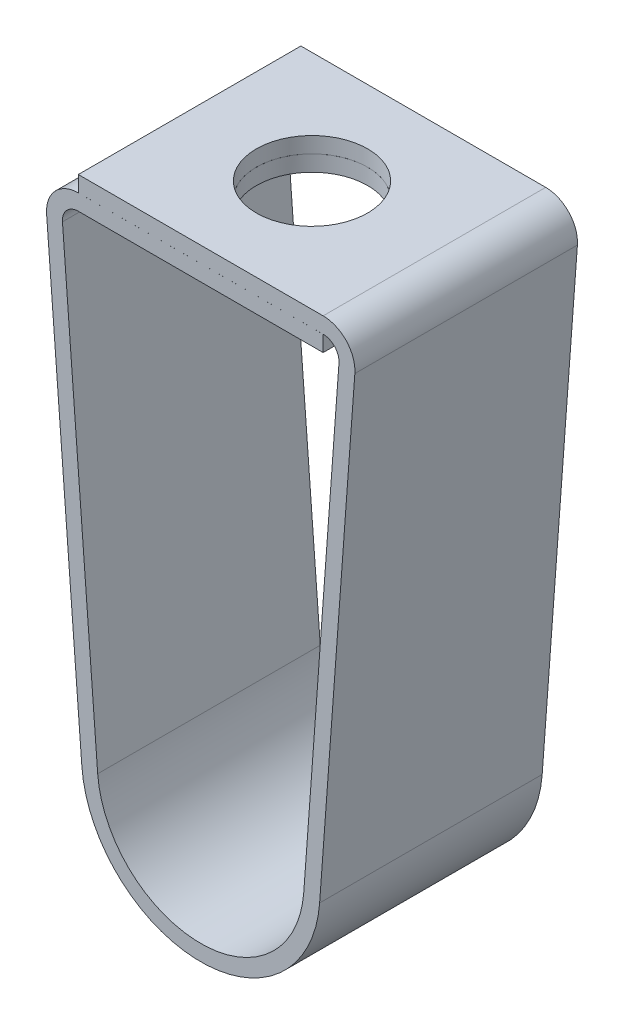
ISO-10303-21;
HEADER;
FILE_DESCRIPTION(('STEP AP214'),'2;1');
FILE_NAME('part.step','',(''),(''),'','','');
FILE_SCHEMA(('AUTOMOTIVE_DESIGN { 1 0 10303 214 1 1 1 1 }'));
ENDSEC;
DATA;
#1=APPLICATION_CONTEXT('core data for automotive mechanical design processes');
#2=APPLICATION_PROTOCOL_DEFINITION('international standard','automotive_design',2000,#1);
#3=PRODUCT_CONTEXT('',#1,'mechanical');
#4=PRODUCT('Part','Part','',(#3));
#5=PRODUCT_RELATED_PRODUCT_CATEGORY('part','',(#4));
#6=PRODUCT_DEFINITION_FORMATION('','',#4);
#7=PRODUCT_DEFINITION_CONTEXT('part definition',#1,'design');
#8=PRODUCT_DEFINITION('design','',#6,#7);
#9=PRODUCT_DEFINITION_SHAPE('','',#8);
#10=(LENGTH_UNIT() NAMED_UNIT(*) SI_UNIT(.MILLI.,.METRE.));
#11=(NAMED_UNIT(*) PLANE_ANGLE_UNIT() SI_UNIT($,.RADIAN.));
#12=(NAMED_UNIT(*) SI_UNIT($,.STERADIAN.) SOLID_ANGLE_UNIT());
#13=UNCERTAINTY_MEASURE_WITH_UNIT(LENGTH_MEASURE(1.E-05),#10,'distance_accuracy_value','');
#14=(GEOMETRIC_REPRESENTATION_CONTEXT(3) GLOBAL_UNCERTAINTY_ASSIGNED_CONTEXT((#13)) GLOBAL_UNIT_ASSIGNED_CONTEXT((#10,
#11,#12)) REPRESENTATION_CONTEXT('',''));
#15=CARTESIAN_POINT('',(0.,0.,0.));
#16=DIRECTION('',(0.,0.,1.));
#17=DIRECTION('',(1.,0.,0.));
#18=AXIS2_PLACEMENT_3D('',#15,#16,#17);
#19=CARTESIAN_POINT('',(-12.22375,48.48225,11.1125));
#20=DIRECTION('',(0.,1.,0.));
#21=DIRECTION('',(-1.,0.,0.));
#22=AXIS2_PLACEMENT_3D('',#19,#20,#21);
#23=PLANE('',#22);
#24=DIRECTION('',(1.,0.,0.));
#25=VECTOR('',#24,1.);
#26=CARTESIAN_POINT('',(-12.22375,48.48225,-11.1125));
#27=LINE('',#26,#25);
#28=CARTESIAN_POINT('',(-12.22375,48.48225,-11.1125));
#29=VERTEX_POINT('',#28);
#30=CARTESIAN_POINT('',(12.22375,48.48225,-11.1125));
#31=VERTEX_POINT('',#30);
#32=EDGE_CURVE('E185',#29,#31,#27,.T.);
#33=ORIENTED_EDGE('',*,*,#32,.T.);
#34=DIRECTION('',(0.,0.,-1.));
#35=VECTOR('',#34,1.);
#36=CARTESIAN_POINT('',(12.22375,48.48225,11.1125));
#37=LINE('',#36,#35);
#38=CARTESIAN_POINT('',(12.22375,48.48225,11.1125));
#39=VERTEX_POINT('',#38);
#40=EDGE_CURVE('E46',#39,#31,#37,.T.);
#41=ORIENTED_EDGE('',*,*,#40,.F.);
#42=DIRECTION('',(1.,0.,0.));
#43=VECTOR('',#42,1.);
#44=CARTESIAN_POINT('',(-12.22375,48.48225,11.1125));
#45=LINE('',#44,#43);
#46=CARTESIAN_POINT('',(-12.22375,48.48225,11.1125));
#47=VERTEX_POINT('',#46);
#48=EDGE_CURVE('E121',#47,#39,#45,.T.);
#49=ORIENTED_EDGE('',*,*,#48,.F.);
#50=DIRECTION('',(0.,0.,-1.));
#51=VECTOR('',#50,1.);
#52=CARTESIAN_POINT('',(-12.22375,48.48225,11.1125));
#53=LINE('',#52,#51);
#54=EDGE_CURVE('E11',#47,#29,#53,.T.);
#55=ORIENTED_EDGE('',*,*,#54,.T.);
#56=EDGE_LOOP('',(#33,#41,#49,#55));
#57=FACE_BOUND('',#56,.T.);
#58=CARTESIAN_POINT('',(0.,48.48225,0.));
#59=DIRECTION('',(0.,1.,0.));
#60=DIRECTION('',(-1.,0.,0.));
#61=AXIS2_PLACEMENT_3D('',#58,#59,#60);
#62=CIRCLE('',#61,5.55625);
#63=CARTESIAN_POINT('',(-5.55625,48.48225,0.));
#64=VERTEX_POINT('',#63);
#65=EDGE_CURVE('E186',#64,#64,#62,.F.);
#66=ORIENTED_EDGE('',*,*,#65,.F.);
#67=EDGE_LOOP('',(#66));
#68=FACE_BOUND('',#67,.T.);
#69=ADVANCED_FACE('F37',(#57,#68),#23,.F.);
#70=CARTESIAN_POINT('',(12.22375,46.8922099999997,11.1125));
#71=DIRECTION('',(0.,1.,0.));
#72=DIRECTION('',(-1.,0.,0.));
#73=AXIS2_PLACEMENT_3D('',#70,#71,#72);
#74=PLANE('',#73);
#75=DIRECTION('',(1.,0.,0.));
#76=VECTOR('',#75,1.);
#77=CARTESIAN_POINT('',(12.22375,46.8922099999997,-11.1125));
#78=LINE('',#77,#76);
#79=CARTESIAN_POINT('',(-12.22375,46.8922099999997,-11.1125));
#80=VERTEX_POINT('',#79);
#81=CARTESIAN_POINT('',(12.22375,46.8922099999997,-11.1125));
#82=VERTEX_POINT('',#81);
#83=EDGE_CURVE('E198',#80,#82,#78,.T.);
#84=ORIENTED_EDGE('',*,*,#83,.T.);
#85=DIRECTION('',(0.,0.,-1.));
#86=VECTOR('',#85,1.);
#87=CARTESIAN_POINT('',(12.22375,46.8922099999997,11.1125));
#88=LINE('',#87,#86);
#89=CARTESIAN_POINT('',(12.22375,46.8922099999997,11.1125));
#90=VERTEX_POINT('',#89);
#91=EDGE_CURVE('E229',#90,#82,#88,.T.);
#92=ORIENTED_EDGE('',*,*,#91,.F.);
#93=DIRECTION('',(1.,0.,0.));
#94=VECTOR('',#93,1.);
#95=CARTESIAN_POINT('',(12.22375,46.8922099999997,11.1125));
#96=LINE('',#95,#94);
#97=CARTESIAN_POINT('',(-12.22375,46.8922099999997,11.1125));
#98=VERTEX_POINT('',#97);
#99=EDGE_CURVE('E278',#98,#90,#96,.T.);
#100=ORIENTED_EDGE('',*,*,#99,.F.);
#101=DIRECTION('',(0.,0.,-1.));
#102=VECTOR('',#101,1.);
#103=CARTESIAN_POINT('',(-12.22375,46.8922099999997,11.1125));
#104=LINE('',#103,#102);
#105=EDGE_CURVE('E232',#98,#80,#104,.T.);
#106=ORIENTED_EDGE('',*,*,#105,.T.);
#107=EDGE_LOOP('',(#84,#92,#100,#106));
#108=FACE_BOUND('',#107,.T.);
#109=CARTESIAN_POINT('',(0.,46.8922099999997,0.));
#110=DIRECTION('',(0.,1.,0.));
#111=DIRECTION('',(-1.,0.,0.));
#112=AXIS2_PLACEMENT_3D('',#109,#110,#111);
#113=CIRCLE('',#112,5.55625);
#114=CARTESIAN_POINT('',(-5.55625,46.8922099999997,0.));
#115=VERTEX_POINT('',#114);
#116=EDGE_CURVE('E312',#115,#115,#113,.F.);
#117=ORIENTED_EDGE('',*,*,#116,.F.);
#118=EDGE_LOOP('',(#117));
#119=FACE_BOUND('',#118,.T.);
#120=ADVANCED_FACE('F325',(#108,#119),#74,.F.);
#121=CARTESIAN_POINT('',(-12.22375,48.4797099999997,11.1125));
#122=DIRECTION('',(0.,-1.,0.));
#123=DIRECTION('',(1.,0.,0.));
#124=AXIS2_PLACEMENT_3D('',#121,#122,#123);
#125=PLANE('',#124);
#126=DIRECTION('',(-1.,0.,0.));
#127=VECTOR('',#126,1.);
#128=CARTESIAN_POINT('',(-12.22375,48.4797099999997,-11.1125));
#129=LINE('',#128,#127);
#130=CARTESIAN_POINT('',(12.22375,48.4797099999997,-11.1125));
#131=VERTEX_POINT('',#130);
#132=CARTESIAN_POINT('',(-12.22375,48.4797099999997,-11.1125));
#133=VERTEX_POINT('',#132);
#134=EDGE_CURVE('E202',#131,#133,#129,.T.);
#135=ORIENTED_EDGE('',*,*,#134,.T.);
#136=DIRECTION('',(0.,0.,-1.));
#137=VECTOR('',#136,1.);
#138=CARTESIAN_POINT('',(-12.22375,48.4797099999997,11.1125));
#139=LINE('',#138,#137);
#140=CARTESIAN_POINT('',(-12.22375,48.4797099999997,11.1125));
#141=VERTEX_POINT('',#140);
#142=EDGE_CURVE('E223',#141,#133,#139,.T.);
#143=ORIENTED_EDGE('',*,*,#142,.F.);
#144=DIRECTION('',(-1.,0.,0.));
#145=VECTOR('',#144,1.);
#146=CARTESIAN_POINT('',(-12.22375,48.4797099999997,11.1125));
#147=LINE('',#146,#145);
#148=CARTESIAN_POINT('',(12.22375,48.4797099999997,11.1125));
#149=VERTEX_POINT('',#148);
#150=EDGE_CURVE('E282',#149,#141,#147,.T.);
#151=ORIENTED_EDGE('',*,*,#150,.F.);
#152=DIRECTION('',(0.,0.,-1.));
#153=VECTOR('',#152,1.);
#154=CARTESIAN_POINT('',(12.22375,48.4797099999997,11.1125));
#155=LINE('',#154,#153);
#156=EDGE_CURVE('E226',#149,#131,#155,.T.);
#157=ORIENTED_EDGE('',*,*,#156,.T.);
#158=EDGE_LOOP('',(#135,#143,#151,#157));
#159=FACE_BOUND('',#158,.T.);
#160=CARTESIAN_POINT('',(0.,48.4797099999997,0.));
#161=DIRECTION('',(0.,-1.,0.));
#162=DIRECTION('',(1.,0.,0.));
#163=AXIS2_PLACEMENT_3D('',#160,#161,#162);
#164=CIRCLE('',#163,5.55625);
#165=CARTESIAN_POINT('',(5.55625,48.4797099999997,0.));
#166=VERTEX_POINT('',#165);
#167=EDGE_CURVE('E309',#166,#166,#164,.F.);
#168=ORIENTED_EDGE('',*,*,#167,.F.);
#169=EDGE_LOOP('',(#168));
#170=FACE_BOUND('',#169,.T.);
#171=ADVANCED_FACE('F303',(#159,#170),#125,.F.);
#172=CARTESIAN_POINT('',(-12.22375,50.06975,11.1125));
#173=DIRECTION('',(0.,-1.,0.));
#174=DIRECTION('',(0.,0.,-1.));
#175=AXIS2_PLACEMENT_3D('',#172,#173,#174);
#176=PLANE('',#175);
#177=DIRECTION('',(-1.,0.,0.));
#178=VECTOR('',#177,1.);
#179=CARTESIAN_POINT('',(-12.22375,50.06975,-11.1125));
#180=LINE('',#179,#178);
#181=CARTESIAN_POINT('',(12.22375,50.06975,-11.1125));
#182=VERTEX_POINT('',#181);
#183=CARTESIAN_POINT('',(-12.22375,50.06975,-11.1125));
#184=VERTEX_POINT('',#183);
#185=EDGE_CURVE('E113',#182,#184,#180,.T.);
#186=ORIENTED_EDGE('',*,*,#185,.T.);
#187=DIRECTION('',(0.,0.,-1.));
#188=VECTOR('',#187,1.);
#189=CARTESIAN_POINT('',(-12.22375,50.06975,11.1125));
#190=LINE('',#189,#188);
#191=CARTESIAN_POINT('',(-12.22375,50.06975,11.1125));
#192=VERTEX_POINT('',#191);
#193=EDGE_CURVE('E178',#192,#184,#190,.T.);
#194=ORIENTED_EDGE('',*,*,#193,.F.);
#195=DIRECTION('',(-1.,0.,0.));
#196=VECTOR('',#195,1.);
#197=CARTESIAN_POINT('',(-12.22375,50.06975,11.1125));
#198=LINE('',#197,#196);
#199=CARTESIAN_POINT('',(12.22375,50.06975,11.1125));
#200=VERTEX_POINT('',#199);
#201=EDGE_CURVE('E54',#200,#192,#198,.T.);
#202=ORIENTED_EDGE('',*,*,#201,.F.);
#203=DIRECTION('',(0.,0.,-1.));
#204=VECTOR('',#203,1.);
#205=CARTESIAN_POINT('',(12.22375,50.06975,11.1125));
#206=LINE('',#205,#204);
#207=EDGE_CURVE('E174',#200,#182,#206,.T.);
#208=ORIENTED_EDGE('',*,*,#207,.T.);
#209=EDGE_LOOP('',(#186,#194,#202,#208));
#210=FACE_BOUND('',#209,.T.);
#211=CARTESIAN_POINT('',(0.,50.06975,0.));
#212=DIRECTION('',(0.,1.,0.));
#213=DIRECTION('',(0.,0.,1.));
#214=AXIS2_PLACEMENT_3D('',#211,#212,#213);
#215=CIRCLE('',#214,5.55625);
#216=CARTESIAN_POINT('',(0.,50.06975,5.55625));
#217=VERTEX_POINT('',#216);
#218=EDGE_CURVE('E307',#217,#217,#215,.T.);
#219=ORIENTED_EDGE('',*,*,#218,.F.);
#220=EDGE_LOOP('',(#219));
#221=FACE_BOUND('',#220,.T.);
#222=ADVANCED_FACE('F300',(#210,#221),#176,.F.);
#223=CARTESIAN_POINT('',(-12.22375,50.06975,11.1125));
#224=DIRECTION('',(1.,0.,0.));
#225=DIRECTION('',(0.,1.,0.));
#226=AXIS2_PLACEMENT_3D('',#223,#224,#225);
#227=PLANE('',#226);
#228=DIRECTION('',(0.,-1.,0.));
#229=VECTOR('',#228,1.);
#230=CARTESIAN_POINT('',(-12.22375,50.06975,-11.1125));
#231=LINE('',#230,#229);
#232=EDGE_CURVE('E182',#184,#29,#231,.T.);
#233=ORIENTED_EDGE('',*,*,#232,.T.);
#234=ORIENTED_EDGE('',*,*,#54,.F.);
#235=DIRECTION('',(0.,-1.,0.));
#236=VECTOR('',#235,1.);
#237=CARTESIAN_POINT('',(-12.22375,50.06975,11.1125));
#238=LINE('',#237,#236);
#239=EDGE_CURVE('E213',#192,#47,#238,.T.);
#240=ORIENTED_EDGE('',*,*,#239,.F.);
#241=ORIENTED_EDGE('',*,*,#193,.T.);
#242=EDGE_LOOP('',(#233,#234,#240,#241));
#243=FACE_BOUND('',#242,.T.);
#244=ADVANCED_FACE('F39',(#243),#227,.F.);
#245=CARTESIAN_POINT('',(12.22375,46.89475,11.1125));
#246=DIRECTION('',(0.,0.,-1.));
#247=DIRECTION('',(-1.,0.,0.));
#248=AXIS2_PLACEMENT_3D('',#245,#246,#247);
#249=CYLINDRICAL_SURFACE('',#248,1.5875);
#250=CARTESIAN_POINT('',(12.22375,46.89475,-11.1125));
#251=DIRECTION('',(0.,0.,-1.));
#252=DIRECTION('',(1.,0.,0.));
#253=AXIS2_PLACEMENT_3D('',#250,#251,#252);
#254=CIRCLE('',#253,1.5875);
#255=CARTESIAN_POINT('',(13.8069250792984,46.7776478297022,-11.1125));
#256=VERTEX_POINT('',#255);
#257=EDGE_CURVE('E188',#31,#256,#254,.T.);
#258=ORIENTED_EDGE('',*,*,#257,.T.);
#259=DIRECTION('',(0.,0.,-1.));
#260=VECTOR('',#259,1.);
#261=CARTESIAN_POINT('',(13.8069250792984,46.7776478297022,11.1125));
#262=LINE('',#261,#260);
#263=CARTESIAN_POINT('',(13.8069250792984,46.7776478297022,11.1125));
#264=VERTEX_POINT('',#263);
#265=EDGE_CURVE('E244',#264,#256,#262,.T.);
#266=ORIENTED_EDGE('',*,*,#265,.F.);
#267=CARTESIAN_POINT('',(12.22375,46.89475,11.1125));
#268=DIRECTION('',(0.,0.,-1.));
#269=DIRECTION('',(1.,0.,0.));
#270=AXIS2_PLACEMENT_3D('',#267,#268,#269);
#271=CIRCLE('',#270,1.5875);
#272=EDGE_CURVE('E252',#39,#264,#271,.T.);
#273=ORIENTED_EDGE('',*,*,#272,.F.);
#274=ORIENTED_EDGE('',*,*,#40,.T.);
#275=EDGE_LOOP('',(#258,#266,#273,#274));
#276=FACE_BOUND('',#275,.T.);
#277=ADVANCED_FACE('F250',(#276),#249,.F.);
#278=CARTESIAN_POINT('',(13.8069250792984,46.7776478297022,11.1125));
#279=DIRECTION('',(0.997275640502938,-0.0737651466443004,0.));
#280=DIRECTION('',(0.0737651466443004,0.997275640502938,0.));
#281=AXIS2_PLACEMENT_3D('',#278,#279,#280);
#282=PLANE('',#281);
#283=DIRECTION('',(-0.0737651466443004,-0.997275640502938,0.));
#284=VECTOR('',#283,1.);
#285=CARTESIAN_POINT('',(13.8069250792984,46.7776478297022,-11.1125));
#286=LINE('',#285,#284);
#287=CARTESIAN_POINT('',(10.2906380154397,-0.761164106935882,-11.1125));
#288=VERTEX_POINT('',#287);
#289=EDGE_CURVE('E190',#256,#288,#286,.T.);
#290=ORIENTED_EDGE('',*,*,#289,.T.);
#291=DIRECTION('',(0.,0.,-1.));
#292=VECTOR('',#291,1.);
#293=CARTESIAN_POINT('',(10.2906380154397,-0.761164106935882,11.1125));
#294=LINE('',#293,#292);
#295=CARTESIAN_POINT('',(10.2906380154397,-0.761164106935882,11.1125));
#296=VERTEX_POINT('',#295);
#297=EDGE_CURVE('E241',#296,#288,#294,.T.);
#298=ORIENTED_EDGE('',*,*,#297,.F.);
#299=DIRECTION('',(-0.0737651466443004,-0.997275640502938,0.));
#300=VECTOR('',#299,1.);
#301=CARTESIAN_POINT('',(13.8069250792984,46.7776478297022,11.1125));
#302=LINE('',#301,#300);
#303=EDGE_CURVE('E270',#264,#296,#302,.T.);
#304=ORIENTED_EDGE('',*,*,#303,.F.);
#305=ORIENTED_EDGE('',*,*,#265,.T.);
#306=EDGE_LOOP('',(#290,#298,#304,#305));
#307=FACE_BOUND('',#306,.T.);
#308=ADVANCED_FACE('F261',(#307),#282,.F.);
#309=CARTESIAN_POINT('',(0.,0.,11.1125));
#310=DIRECTION('',(0.,0.,-1.));
#311=DIRECTION('',(-1.,0.,0.));
#312=AXIS2_PLACEMENT_3D('',#309,#310,#311);
#313=CYLINDRICAL_SURFACE('',#312,10.31875);
#314=CARTESIAN_POINT('',(0.,0.,-11.1125));
#315=DIRECTION('',(0.,0.,-1.));
#316=DIRECTION('',(1.,0.,0.));
#317=AXIS2_PLACEMENT_3D('',#314,#315,#316);
#318=CIRCLE('',#317,10.31875);
#319=CARTESIAN_POINT('',(-10.2886678727336,-0.787346789590499,-11.1125));
#320=VERTEX_POINT('',#319);
#321=EDGE_CURVE('E192',#288,#320,#318,.T.);
#322=ORIENTED_EDGE('',*,*,#321,.T.);
#323=DIRECTION('',(0.,0.,-1.));
#324=VECTOR('',#323,1.);
#325=CARTESIAN_POINT('',(-10.2886678727336,-0.787346789590499,11.1125));
#326=LINE('',#325,#324);
#327=CARTESIAN_POINT('',(-10.2886678727336,-0.787346789590499,11.1125));
#328=VERTEX_POINT('',#327);
#329=EDGE_CURVE('E238',#328,#320,#326,.T.);
#330=ORIENTED_EDGE('',*,*,#329,.F.);
#331=CARTESIAN_POINT('',(0.,0.,11.1125));
#332=DIRECTION('',(0.,0.,-1.));
#333=DIRECTION('',(1.,0.,0.));
#334=AXIS2_PLACEMENT_3D('',#331,#332,#333);
#335=CIRCLE('',#334,10.31875);
#336=EDGE_CURVE('E267',#296,#328,#335,.T.);
#337=ORIENTED_EDGE('',*,*,#336,.F.);
#338=ORIENTED_EDGE('',*,*,#297,.T.);
#339=EDGE_LOOP('',(#322,#330,#337,#338));
#340=FACE_BOUND('',#339,.T.);
#341=ADVANCED_FACE('F265',(#340),#313,.F.);
#342=CARTESIAN_POINT('',(-13.8066219804206,45.183579724678,11.1125));
#343=DIRECTION('',(-0.997084712075944,-0.0763025356356637,0.));
#344=DIRECTION('',(0.0763025356356637,-0.997084712075944,0.));
#345=AXIS2_PLACEMENT_3D('',#342,#343,#344);
#346=PLANE('',#345);
#347=DIRECTION('',(-0.0763025356356637,0.997084712075944,0.));
#348=VECTOR('',#347,1.);
#349=CARTESIAN_POINT('',(-13.8066219804206,45.183579724678,-11.1125));
#350=LINE('',#349,#348);
#351=CARTESIAN_POINT('',(-13.8066219804206,45.183579724678,-11.1125));
#352=VERTEX_POINT('',#351);
#353=EDGE_CURVE('E194',#320,#352,#350,.T.);
#354=ORIENTED_EDGE('',*,*,#353,.T.);
#355=DIRECTION('',(0.,0.,-1.));
#356=VECTOR('',#355,1.);
#357=CARTESIAN_POINT('',(-13.8066219804206,45.183579724678,11.1125));
#358=LINE('',#357,#356);
#359=CARTESIAN_POINT('',(-13.8066219804206,45.183579724678,11.1125));
#360=VERTEX_POINT('',#359);
#361=EDGE_CURVE('E235',#360,#352,#358,.T.);
#362=ORIENTED_EDGE('',*,*,#361,.F.);
#363=DIRECTION('',(-0.0763025356356637,0.997084712075944,0.));
#364=VECTOR('',#363,1.);
#365=CARTESIAN_POINT('',(-13.8066219804206,45.183579724678,11.1125));
#366=LINE('',#365,#364);
#367=EDGE_CURVE('E269',#328,#360,#366,.T.);
#368=ORIENTED_EDGE('',*,*,#367,.F.);
#369=ORIENTED_EDGE('',*,*,#329,.T.);
#370=EDGE_LOOP('',(#354,#362,#368,#369));
#371=FACE_BOUND('',#370,.T.);
#372=ADVANCED_FACE('F338',(#371),#346,.F.);
#373=CARTESIAN_POINT('',(-12.22375,45.3047099999997,11.1125));
#374=DIRECTION('',(0.,0.,-1.));
#375=DIRECTION('',(-1.,0.,0.));
#376=AXIS2_PLACEMENT_3D('',#373,#374,#375);
#377=CYLINDRICAL_SURFACE('',#376,1.5875);
#378=CARTESIAN_POINT('',(-12.22375,45.3047099999997,-11.1125));
#379=DIRECTION('',(0.,0.,-1.));
#380=DIRECTION('',(-1.,0.,0.));
#381=AXIS2_PLACEMENT_3D('',#378,#379,#380);
#382=CIRCLE('',#381,1.5875);
#383=EDGE_CURVE('E196',#352,#80,#382,.T.);
#384=ORIENTED_EDGE('',*,*,#383,.T.);
#385=ORIENTED_EDGE('',*,*,#105,.F.);
#386=CARTESIAN_POINT('',(-12.22375,45.3047099999997,11.1125));
#387=DIRECTION('',(0.,0.,-1.));
#388=DIRECTION('',(-1.,0.,0.));
#389=AXIS2_PLACEMENT_3D('',#386,#387,#388);
#390=CIRCLE('',#389,1.5875);
#391=EDGE_CURVE('E272',#360,#98,#390,.T.);
#392=ORIENTED_EDGE('',*,*,#391,.F.);
#393=ORIENTED_EDGE('',*,*,#361,.T.);
#394=EDGE_LOOP('',(#384,#385,#392,#393));
#395=FACE_BOUND('',#394,.T.);
#396=ADVANCED_FACE('F341',(#395),#377,.F.);
#397=CARTESIAN_POINT('',(12.22375,48.4797099999997,11.1125));
#398=DIRECTION('',(-1.,0.,0.));
#399=DIRECTION('',(0.,0.,1.));
#400=AXIS2_PLACEMENT_3D('',#397,#398,#399);
#401=PLANE('',#400);
#402=DIRECTION('',(0.,1.,0.));
#403=VECTOR('',#402,1.);
#404=CARTESIAN_POINT('',(12.22375,48.4797099999997,-11.1125));
#405=LINE('',#404,#403);
#406=EDGE_CURVE('E200',#82,#131,#405,.T.);
#407=ORIENTED_EDGE('',*,*,#406,.T.);
#408=ORIENTED_EDGE('',*,*,#156,.F.);
#409=DIRECTION('',(0.,1.,0.));
#410=VECTOR('',#409,1.);
#411=CARTESIAN_POINT('',(12.22375,48.4797099999997,11.1125));
#412=LINE('',#411,#410);
#413=EDGE_CURVE('E280',#90,#149,#412,.T.);
#414=ORIENTED_EDGE('',*,*,#413,.F.);
#415=ORIENTED_EDGE('',*,*,#91,.T.);
#416=EDGE_LOOP('',(#407,#408,#414,#415));
#417=FACE_BOUND('',#416,.T.);
#418=ADVANCED_FACE('F344',(#417),#401,.F.);
#419=CARTESIAN_POINT('',(-12.22375,45.3047099999997,11.1125));
#420=DIRECTION('',(0.,0.,-1.));
#421=DIRECTION('',(-1.,0.,0.));
#422=AXIS2_PLACEMENT_3D('',#419,#420,#421);
#423=CYLINDRICAL_SURFACE('',#422,3.17500000000001);
#424=CARTESIAN_POINT('',(-12.22375,45.3047099999997,-11.1125));
#425=DIRECTION('',(0.,0.,1.));
#426=DIRECTION('',(-1.,0.,0.));
#427=AXIS2_PLACEMENT_3D('',#424,#425,#426);
#428=CIRCLE('',#427,3.17500000000001);
#429=CARTESIAN_POINT('',(-15.3894939608412,45.0624494493564,-11.1125));
#430=VERTEX_POINT('',#429);
#431=EDGE_CURVE('E204',#133,#430,#428,.T.);
#432=ORIENTED_EDGE('',*,*,#431,.T.);
#433=DIRECTION('',(0.,0.,-1.));
#434=VECTOR('',#433,1.);
#435=CARTESIAN_POINT('',(-15.3894939608412,45.0624494493564,11.1125));
#436=LINE('',#435,#434);
#437=CARTESIAN_POINT('',(-15.3894939608412,45.0624494493564,11.1125));
#438=VERTEX_POINT('',#437);
#439=EDGE_CURVE('E220',#438,#430,#436,.T.);
#440=ORIENTED_EDGE('',*,*,#439,.F.);
#441=CARTESIAN_POINT('',(-12.22375,45.3047099999997,11.1125));
#442=DIRECTION('',(0.,0.,1.));
#443=DIRECTION('',(-1.,0.,0.));
#444=AXIS2_PLACEMENT_3D('',#441,#442,#443);
#445=CIRCLE('',#444,3.17500000000001);
#446=EDGE_CURVE('E284',#141,#438,#445,.T.);
#447=ORIENTED_EDGE('',*,*,#446,.F.);
#448=ORIENTED_EDGE('',*,*,#142,.T.);
#449=EDGE_LOOP('',(#432,#440,#447,#448));
#450=FACE_BOUND('',#449,.T.);
#451=ADVANCED_FACE('F349',(#450),#423,.T.);
#452=CARTESIAN_POINT('',(-11.8715398531542,-0.908477064912116,11.1125));
#453=DIRECTION('',(0.997084712075944,0.0763025356356635,0.));
#454=DIRECTION('',(-0.0763025356356635,0.997084712075944,0.));
#455=AXIS2_PLACEMENT_3D('',#452,#453,#454);
#456=PLANE('',#455);
#457=DIRECTION('',(0.0763025356356635,-0.997084712075944,0.));
#458=VECTOR('',#457,1.);
#459=CARTESIAN_POINT('',(-11.8715398531542,-0.908477064912116,-11.1125));
#460=LINE('',#459,#458);
#461=CARTESIAN_POINT('',(-11.8715398531542,-0.908477064912116,-11.1125));
#462=VERTEX_POINT('',#461);
#463=EDGE_CURVE('E206',#430,#462,#460,.T.);
#464=ORIENTED_EDGE('',*,*,#463,.T.);
#465=DIRECTION('',(0.,0.,-1.));
#466=VECTOR('',#465,1.);
#467=CARTESIAN_POINT('',(-11.8715398531542,-0.908477064912116,11.1125));
#468=LINE('',#467,#466);
#469=CARTESIAN_POINT('',(-11.8715398531542,-0.908477064912116,11.1125));
#470=VERTEX_POINT('',#469);
#471=EDGE_CURVE('E217',#470,#462,#468,.T.);
#472=ORIENTED_EDGE('',*,*,#471,.F.);
#473=DIRECTION('',(0.0763025356356635,-0.997084712075944,0.));
#474=VECTOR('',#473,1.);
#475=CARTESIAN_POINT('',(-11.8715398531542,-0.908477064912116,11.1125));
#476=LINE('',#475,#474);
#477=EDGE_CURVE('E286',#438,#470,#476,.T.);
#478=ORIENTED_EDGE('',*,*,#477,.F.);
#479=ORIENTED_EDGE('',*,*,#439,.T.);
#480=EDGE_LOOP('',(#464,#472,#478,#479));
#481=FACE_BOUND('',#480,.T.);
#482=ADVANCED_FACE('F292',(#481),#456,.F.);
#483=CARTESIAN_POINT('',(0.,0.,11.1125));
#484=DIRECTION('',(0.,0.,-1.));
#485=DIRECTION('',(-1.,0.,0.));
#486=AXIS2_PLACEMENT_3D('',#483,#484,#485);
#487=CYLINDRICAL_SURFACE('',#486,11.90625);
#488=CARTESIAN_POINT('',(0.,0.,-11.1125));
#489=DIRECTION('',(0.,0.,1.));
#490=DIRECTION('',(1.,0.,0.));
#491=AXIS2_PLACEMENT_3D('',#488,#489,#490);
#492=CIRCLE('',#491,11.90625);
#493=CARTESIAN_POINT('',(11.8738130947381,-0.878266277233693,-11.1125));
#494=VERTEX_POINT('',#493);
#495=EDGE_CURVE('E208',#462,#494,#492,.T.);
#496=ORIENTED_EDGE('',*,*,#495,.T.);
#497=DIRECTION('',(0.,0.,-1.));
#498=VECTOR('',#497,1.);
#499=CARTESIAN_POINT('',(11.8738130947381,-0.878266277233693,11.1125));
#500=LINE('',#499,#498);
#501=CARTESIAN_POINT('',(11.8738130947381,-0.878266277233693,11.1125));
#502=VERTEX_POINT('',#501);
#503=EDGE_CURVE('E173',#502,#494,#500,.T.);
#504=ORIENTED_EDGE('',*,*,#503,.F.);
#505=CARTESIAN_POINT('',(0.,0.,11.1125));
#506=DIRECTION('',(0.,0.,1.));
#507=DIRECTION('',(1.,0.,0.));
#508=AXIS2_PLACEMENT_3D('',#505,#506,#507);
#509=CIRCLE('',#508,11.90625);
#510=EDGE_CURVE('E164',#470,#502,#509,.T.);
#511=ORIENTED_EDGE('',*,*,#510,.F.);
#512=ORIENTED_EDGE('',*,*,#471,.T.);
#513=EDGE_LOOP('',(#496,#504,#511,#512));
#514=FACE_BOUND('',#513,.T.);
#515=ADVANCED_FACE('F296',(#514),#487,.T.);
#516=CARTESIAN_POINT('',(15.3901001585969,46.6605456594043,11.1125));
#517=DIRECTION('',(-0.997275640502938,0.0737651466443007,0.));
#518=DIRECTION('',(-0.0737651466443007,-0.997275640502938,0.));
#519=AXIS2_PLACEMENT_3D('',#516,#517,#518);
#520=PLANE('',#519);
#521=DIRECTION('',(0.0737651466443007,0.997275640502938,0.));
#522=VECTOR('',#521,1.);
#523=CARTESIAN_POINT('',(15.3901001585969,46.6605456594043,-11.1125));
#524=LINE('',#523,#522);
#525=CARTESIAN_POINT('',(15.3901001585969,46.6605456594043,-11.1125));
#526=VERTEX_POINT('',#525);
#527=EDGE_CURVE('E172',#494,#526,#524,.T.);
#528=ORIENTED_EDGE('',*,*,#527,.T.);
#529=DIRECTION('',(0.,0.,-1.));
#530=VECTOR('',#529,1.);
#531=CARTESIAN_POINT('',(15.3901001585969,46.6605456594043,11.1125));
#532=LINE('',#531,#530);
#533=CARTESIAN_POINT('',(15.3901001585969,46.6605456594043,11.1125));
#534=VERTEX_POINT('',#533);
#535=EDGE_CURVE('E169',#534,#526,#532,.T.);
#536=ORIENTED_EDGE('',*,*,#535,.F.);
#537=DIRECTION('',(0.0737651466443007,0.997275640502938,0.));
#538=VECTOR('',#537,1.);
#539=CARTESIAN_POINT('',(15.3901001585969,46.6605456594043,11.1125));
#540=LINE('',#539,#538);
#541=EDGE_CURVE('E158',#502,#534,#540,.T.);
#542=ORIENTED_EDGE('',*,*,#541,.F.);
#543=ORIENTED_EDGE('',*,*,#503,.T.);
#544=EDGE_LOOP('',(#528,#536,#542,#543));
#545=FACE_BOUND('',#544,.T.);
#546=ADVANCED_FACE('F170',(#545),#520,.F.);
#547=CARTESIAN_POINT('',(12.22375,46.89475,11.1125));
#548=DIRECTION('',(0.,0.,-1.));
#549=DIRECTION('',(-1.,0.,0.));
#550=AXIS2_PLACEMENT_3D('',#547,#548,#549);
#551=CYLINDRICAL_SURFACE('',#550,3.17500000000001);
#552=CARTESIAN_POINT('',(12.22375,46.89475,-11.1125));
#553=DIRECTION('',(0.,0.,1.));
#554=DIRECTION('',(1.,0.,0.));
#555=AXIS2_PLACEMENT_3D('',#552,#553,#554);
#556=CIRCLE('',#555,3.17500000000001);
#557=EDGE_CURVE('E107',#526,#182,#556,.T.);
#558=ORIENTED_EDGE('',*,*,#557,.T.);
#559=ORIENTED_EDGE('',*,*,#207,.F.);
#560=CARTESIAN_POINT('',(12.22375,46.89475,11.1125));
#561=DIRECTION('',(0.,0.,1.));
#562=DIRECTION('',(1.,0.,0.));
#563=AXIS2_PLACEMENT_3D('',#560,#561,#562);
#564=CIRCLE('',#563,3.17500000000001);
#565=EDGE_CURVE('E162',#534,#200,#564,.T.);
#566=ORIENTED_EDGE('',*,*,#565,.F.);
#567=ORIENTED_EDGE('',*,*,#535,.T.);
#568=EDGE_LOOP('',(#558,#559,#566,#567));
#569=FACE_BOUND('',#568,.T.);
#570=ADVANCED_FACE('F176',(#569),#551,.T.);
#571=CARTESIAN_POINT('',(12.22375,46.89475,11.1125));
#572=DIRECTION('',(0.,0.,1.));
#573=DIRECTION('',(1.,0.,0.));
#574=AXIS2_PLACEMENT_3D('',#571,#572,#573);
#575=PLANE('',#574);
#576=ORIENTED_EDGE('',*,*,#239,.T.);
#577=ORIENTED_EDGE('',*,*,#48,.T.);
#578=ORIENTED_EDGE('',*,*,#272,.T.);
#579=ORIENTED_EDGE('',*,*,#303,.T.);
#580=ORIENTED_EDGE('',*,*,#336,.T.);
#581=ORIENTED_EDGE('',*,*,#367,.T.);
#582=ORIENTED_EDGE('',*,*,#391,.T.);
#583=ORIENTED_EDGE('',*,*,#99,.T.);
#584=ORIENTED_EDGE('',*,*,#413,.T.);
#585=ORIENTED_EDGE('',*,*,#150,.T.);
#586=ORIENTED_EDGE('',*,*,#446,.T.);
#587=ORIENTED_EDGE('',*,*,#477,.T.);
#588=ORIENTED_EDGE('',*,*,#510,.T.);
#589=ORIENTED_EDGE('',*,*,#541,.T.);
#590=ORIENTED_EDGE('',*,*,#565,.T.);
#591=ORIENTED_EDGE('',*,*,#201,.T.);
#592=EDGE_LOOP('',(#576,#577,#578,#579,#580,#581,#582,#583,#584,#585,#586,#587,#588,#589,#590,#591));
#593=FACE_BOUND('',#592,.T.);
#594=ADVANCED_FACE('F160',(#593),#575,.T.);
#595=CARTESIAN_POINT('',(12.22375,46.89475,-11.1125));
#596=DIRECTION('',(0.,0.,1.));
#597=DIRECTION('',(1.,0.,0.));
#598=AXIS2_PLACEMENT_3D('',#595,#596,#597);
#599=PLANE('',#598);
#600=ORIENTED_EDGE('',*,*,#232,.F.);
#601=ORIENTED_EDGE('',*,*,#185,.F.);
#602=ORIENTED_EDGE('',*,*,#557,.F.);
#603=ORIENTED_EDGE('',*,*,#527,.F.);
#604=ORIENTED_EDGE('',*,*,#495,.F.);
#605=ORIENTED_EDGE('',*,*,#463,.F.);
#606=ORIENTED_EDGE('',*,*,#431,.F.);
#607=ORIENTED_EDGE('',*,*,#134,.F.);
#608=ORIENTED_EDGE('',*,*,#406,.F.);
#609=ORIENTED_EDGE('',*,*,#83,.F.);
#610=ORIENTED_EDGE('',*,*,#383,.F.);
#611=ORIENTED_EDGE('',*,*,#353,.F.);
#612=ORIENTED_EDGE('',*,*,#321,.F.);
#613=ORIENTED_EDGE('',*,*,#289,.F.);
#614=ORIENTED_EDGE('',*,*,#257,.F.);
#615=ORIENTED_EDGE('',*,*,#32,.F.);
#616=EDGE_LOOP('',(#600,#601,#602,#603,#604,#605,#606,#607,#608,#609,#610,#611,#612,#613,#614,#615));
#617=FACE_BOUND('',#616,.T.);
#618=ADVANCED_FACE('F256',(#617),#599,.F.);
#619=CARTESIAN_POINT('',(0.,50.06975,0.));
#620=DIRECTION('',(0.,-1.,0.));
#621=DIRECTION('',(0.,0.,-1.));
#622=AXIS2_PLACEMENT_3D('',#619,#620,#621);
#623=CYLINDRICAL_SURFACE('',#622,5.55625);
#624=ORIENTED_EDGE('',*,*,#218,.T.);
#625=EDGE_LOOP('',(#624));
#626=FACE_BOUND('',#625,.T.);
#627=ORIENTED_EDGE('',*,*,#65,.T.);
#628=EDGE_LOOP('',(#627));
#629=FACE_BOUND('',#628,.T.);
#630=ADVANCED_FACE('F322',(#626,#629),#623,.F.);
#631=ORIENTED_EDGE('',*,*,#167,.T.);
#632=EDGE_LOOP('',(#631));
#633=FACE_BOUND('',#632,.T.);
#634=ORIENTED_EDGE('',*,*,#116,.T.);
#635=EDGE_LOOP('',(#634));
#636=FACE_BOUND('',#635,.T.);
#637=ADVANCED_FACE('F370',(#633,#636),#623,.F.);
#638=CLOSED_SHELL('',(#69,#120,#171,#222,#244,#277,#308,#341,#372,#396,#418,#451,#482,#515,#546,
#570,#594,#618,#630,#637));
#639=MANIFOLD_SOLID_BREP('B2',#638);
#640=ADVANCED_BREP_SHAPE_REPRESENTATION('',(#18,#639),#14);
#641=SHAPE_DEFINITION_REPRESENTATION(#9,#640);
ENDSEC;
END-ISO-10303-21;
